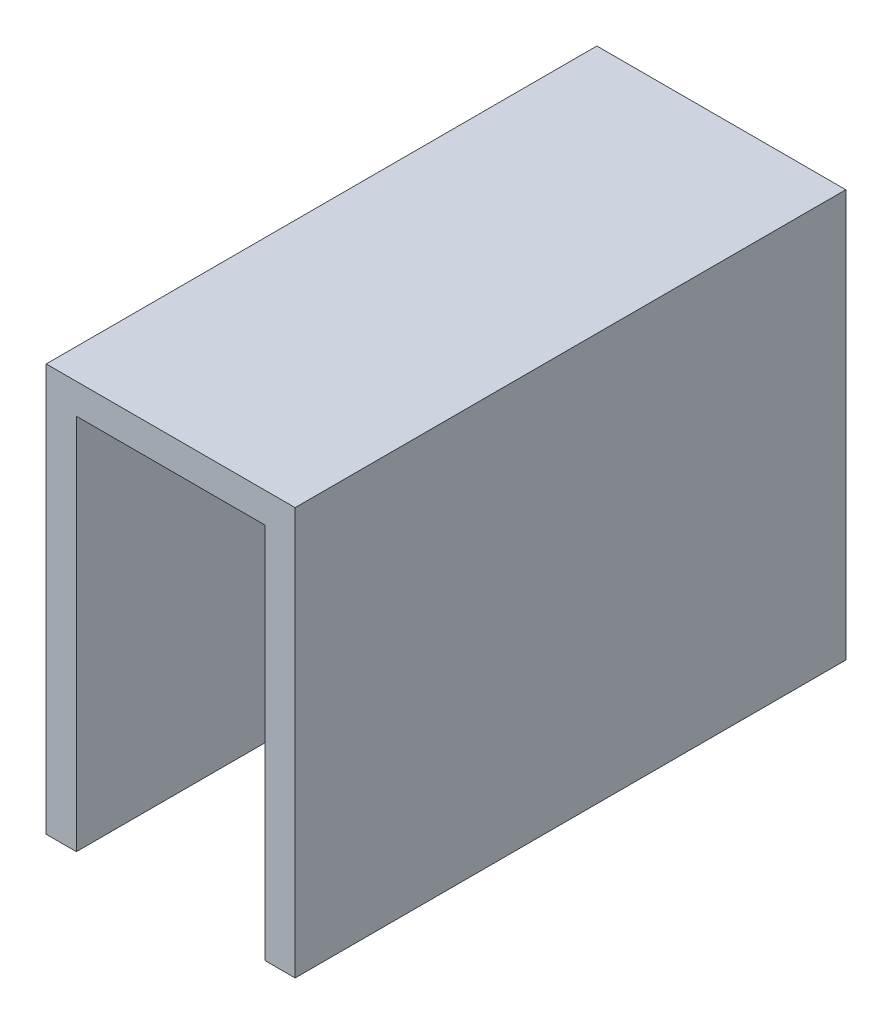
ISO-10303-21;
HEADER;
FILE_DESCRIPTION(('STEP AP214'),'2;1');
FILE_NAME('part.step','',(''),(''),'','','');
FILE_SCHEMA(('AUTOMOTIVE_DESIGN { 1 0 10303 214 1 1 1 1 }'));
ENDSEC;
DATA;
#1=APPLICATION_CONTEXT('core data for automotive mechanical design processes');
#2=APPLICATION_PROTOCOL_DEFINITION('international standard','automotive_design',2000,#1);
#3=PRODUCT_CONTEXT('',#1,'mechanical');
#4=PRODUCT('Part','Part','',(#3));
#5=PRODUCT_RELATED_PRODUCT_CATEGORY('part','',(#4));
#6=PRODUCT_DEFINITION_FORMATION('','',#4);
#7=PRODUCT_DEFINITION_CONTEXT('part definition',#1,'design');
#8=PRODUCT_DEFINITION('design','',#6,#7);
#9=PRODUCT_DEFINITION_SHAPE('','',#8);
#10=(LENGTH_UNIT() NAMED_UNIT(*) SI_UNIT(.MILLI.,.METRE.));
#11=(NAMED_UNIT(*) PLANE_ANGLE_UNIT() SI_UNIT($,.RADIAN.));
#12=(NAMED_UNIT(*) SI_UNIT($,.STERADIAN.) SOLID_ANGLE_UNIT());
#13=UNCERTAINTY_MEASURE_WITH_UNIT(LENGTH_MEASURE(1.E-05),#10,'distance_accuracy_value','');
#14=(GEOMETRIC_REPRESENTATION_CONTEXT(3) GLOBAL_UNCERTAINTY_ASSIGNED_CONTEXT((#13)) GLOBAL_UNIT_ASSIGNED_CONTEXT((#10,
#11,#12)) REPRESENTATION_CONTEXT('',''));
#15=CARTESIAN_POINT('',(0.,0.,0.));
#16=DIRECTION('',(0.,0.,1.));
#17=DIRECTION('',(1.,0.,0.));
#18=AXIS2_PLACEMENT_3D('',#15,#16,#17);
#19=CARTESIAN_POINT('',(0.,0.,70.));
#20=DIRECTION('',(0.,0.,-1.));
#21=DIRECTION('',(-1.,0.,0.));
#22=AXIS2_PLACEMENT_3D('',#19,#20,#21);
#23=PLANE('',#22);
#24=DIRECTION('',(0.,-1.,0.));
#25=VECTOR('',#24,1.);
#26=CARTESIAN_POINT('',(-16.5,29.,70.));
#27=LINE('',#26,#25);
#28=CARTESIAN_POINT('',(-16.5,29.,70.));
#29=VERTEX_POINT('',#28);
#30=CARTESIAN_POINT('',(-16.5,-25.,70.));
#31=VERTEX_POINT('',#30);
#32=EDGE_CURVE('E153',#29,#31,#27,.T.);
#33=ORIENTED_EDGE('',*,*,#32,.T.);
#34=DIRECTION('',(-1.,0.,0.));
#35=VECTOR('',#34,1.);
#36=CARTESIAN_POINT('',(-16.5,-25.,70.));
#37=LINE('',#36,#35);
#38=CARTESIAN_POINT('',(-12.5,-25.,70.));
#39=VERTEX_POINT('',#38);
#40=EDGE_CURVE('E164',#39,#31,#37,.T.);
#41=ORIENTED_EDGE('',*,*,#40,.F.);
#42=DIRECTION('',(0.,-1.,0.));
#43=VECTOR('',#42,1.);
#44=CARTESIAN_POINT('',(-12.5,25.,70.));
#45=LINE('',#44,#43);
#46=CARTESIAN_POINT('',(-12.5,25.,70.));
#47=VERTEX_POINT('',#46);
#48=EDGE_CURVE('E126',#47,#39,#45,.T.);
#49=ORIENTED_EDGE('',*,*,#48,.F.);
#50=DIRECTION('',(-1.,0.,0.));
#51=VECTOR('',#50,1.);
#52=CARTESIAN_POINT('',(-12.5,25.,70.));
#53=LINE('',#52,#51);
#54=CARTESIAN_POINT('',(12.5,25.,70.));
#55=VERTEX_POINT('',#54);
#56=EDGE_CURVE('E132',#55,#47,#53,.T.);
#57=ORIENTED_EDGE('',*,*,#56,.F.);
#58=DIRECTION('',(0.,1.,0.));
#59=VECTOR('',#58,1.);
#60=CARTESIAN_POINT('',(12.5,25.,70.));
#61=LINE('',#60,#59);
#62=CARTESIAN_POINT('',(12.5,-25.,70.));
#63=VERTEX_POINT('',#62);
#64=EDGE_CURVE('E129',#63,#55,#61,.T.);
#65=ORIENTED_EDGE('',*,*,#64,.F.);
#66=CARTESIAN_POINT('',(16.5,-25.,70.));
#67=VERTEX_POINT('',#66);
#68=EDGE_CURVE('E103',#67,#63,#37,.T.);
#69=ORIENTED_EDGE('',*,*,#68,.F.);
#70=DIRECTION('',(0.,1.,0.));
#71=VECTOR('',#70,1.);
#72=CARTESIAN_POINT('',(16.5,29.,70.));
#73=LINE('',#72,#71);
#74=CARTESIAN_POINT('',(16.5,29.,70.));
#75=VERTEX_POINT('',#74);
#76=EDGE_CURVE('E111',#67,#75,#73,.T.);
#77=ORIENTED_EDGE('',*,*,#76,.T.);
#78=DIRECTION('',(-1.,0.,0.));
#79=VECTOR('',#78,1.);
#80=CARTESIAN_POINT('',(-16.5,29.,70.));
#81=LINE('',#80,#79);
#82=EDGE_CURVE('E150',#75,#29,#81,.T.);
#83=ORIENTED_EDGE('',*,*,#82,.T.);
#84=EDGE_LOOP('',(#33,#41,#49,#57,#65,#69,#77,#83));
#85=FACE_BOUND('',#84,.T.);
#86=ADVANCED_FACE('F33',(#85),#23,.F.);
#87=CARTESIAN_POINT('',(-16.5,29.,70.));
#88=DIRECTION('',(0.,-1.,0.));
#89=DIRECTION('',(0.,0.,-1.));
#90=AXIS2_PLACEMENT_3D('',#87,#88,#89);
#91=PLANE('',#90);
#92=DIRECTION('',(0.,0.,-1.));
#93=VECTOR('',#92,1.);
#94=CARTESIAN_POINT('',(16.5,29.,70.));
#95=LINE('',#94,#93);
#96=CARTESIAN_POINT('',(16.5,29.,-3.));
#97=VERTEX_POINT('',#96);
#98=EDGE_CURVE('E41',#75,#97,#95,.T.);
#99=ORIENTED_EDGE('',*,*,#98,.T.);
#100=DIRECTION('',(1.,0.,0.));
#101=VECTOR('',#100,1.);
#102=CARTESIAN_POINT('',(-16.5,29.,-3.));
#103=LINE('',#102,#101);
#104=CARTESIAN_POINT('',(-16.5,29.,-3.));
#105=VERTEX_POINT('',#104);
#106=EDGE_CURVE('E116',#105,#97,#103,.T.);
#107=ORIENTED_EDGE('',*,*,#106,.F.);
#108=DIRECTION('',(0.,0.,-1.));
#109=VECTOR('',#108,1.);
#110=CARTESIAN_POINT('',(-16.5,29.,70.));
#111=LINE('',#110,#109);
#112=EDGE_CURVE('E11',#29,#105,#111,.T.);
#113=ORIENTED_EDGE('',*,*,#112,.F.);
#114=ORIENTED_EDGE('',*,*,#82,.F.);
#115=EDGE_LOOP('',(#99,#107,#113,#114));
#116=FACE_BOUND('',#115,.T.);
#117=ADVANCED_FACE('F35',(#116),#91,.F.);
#118=CARTESIAN_POINT('',(-16.5,29.,70.));
#119=DIRECTION('',(1.,0.,0.));
#120=DIRECTION('',(0.,0.,-1.));
#121=AXIS2_PLACEMENT_3D('',#118,#119,#120);
#122=PLANE('',#121);
#123=DIRECTION('',(0.,1.,0.));
#124=VECTOR('',#123,1.);
#125=CARTESIAN_POINT('',(-16.5,-29.,-3.));
#126=LINE('',#125,#124);
#127=CARTESIAN_POINT('',(-16.5,-25.,-3.));
#128=VERTEX_POINT('',#127);
#129=EDGE_CURVE('E122',#128,#105,#126,.T.);
#130=ORIENTED_EDGE('',*,*,#129,.F.);
#131=DIRECTION('',(0.,0.,1.));
#132=VECTOR('',#131,1.);
#133=CARTESIAN_POINT('',(-16.5,-25.,-3.));
#134=LINE('',#133,#132);
#135=EDGE_CURVE('E48',#128,#31,#134,.T.);
#136=ORIENTED_EDGE('',*,*,#135,.T.);
#137=ORIENTED_EDGE('',*,*,#32,.F.);
#138=ORIENTED_EDGE('',*,*,#112,.T.);
#139=EDGE_LOOP('',(#130,#136,#137,#138));
#140=FACE_BOUND('',#139,.T.);
#141=ADVANCED_FACE('F168',(#140),#122,.F.);
#142=CARTESIAN_POINT('',(16.5,29.,70.));
#143=DIRECTION('',(-1.,0.,0.));
#144=DIRECTION('',(0.,0.,1.));
#145=AXIS2_PLACEMENT_3D('',#142,#143,#144);
#146=PLANE('',#145);
#147=ORIENTED_EDGE('',*,*,#76,.F.);
#148=DIRECTION('',(0.,0.,1.));
#149=VECTOR('',#148,1.);
#150=CARTESIAN_POINT('',(16.5,-25.,-3.));
#151=LINE('',#150,#149);
#152=CARTESIAN_POINT('',(16.5,-25.,-3.));
#153=VERTEX_POINT('',#152);
#154=EDGE_CURVE('E98',#153,#67,#151,.T.);
#155=ORIENTED_EDGE('',*,*,#154,.F.);
#156=DIRECTION('',(0.,-1.,0.));
#157=VECTOR('',#156,1.);
#158=CARTESIAN_POINT('',(16.5,29.,-3.));
#159=LINE('',#158,#157);
#160=EDGE_CURVE('E110',#97,#153,#159,.T.);
#161=ORIENTED_EDGE('',*,*,#160,.F.);
#162=ORIENTED_EDGE('',*,*,#98,.F.);
#163=EDGE_LOOP('',(#147,#155,#161,#162));
#164=FACE_BOUND('',#163,.T.);
#165=ADVANCED_FACE('F108',(#164),#146,.F.);
#166=CARTESIAN_POINT('',(-12.5,25.,70.));
#167=DIRECTION('',(1.,0.,0.));
#168=DIRECTION('',(0.,0.,-1.));
#169=AXIS2_PLACEMENT_3D('',#166,#167,#168);
#170=PLANE('',#169);
#171=DIRECTION('',(0.,-1.,0.));
#172=VECTOR('',#171,1.);
#173=CARTESIAN_POINT('',(-12.5,25.,0.));
#174=LINE('',#173,#172);
#175=CARTESIAN_POINT('',(-12.5,25.,0.));
#176=VERTEX_POINT('',#175);
#177=CARTESIAN_POINT('',(-12.5,-25.,0.));
#178=VERTEX_POINT('',#177);
#179=EDGE_CURVE('E117',#176,#178,#174,.T.);
#180=ORIENTED_EDGE('',*,*,#179,.F.);
#181=DIRECTION('',(0.,0.,-1.));
#182=VECTOR('',#181,1.);
#183=CARTESIAN_POINT('',(-12.5,25.,70.));
#184=LINE('',#183,#182);
#185=EDGE_CURVE('E133',#47,#176,#184,.T.);
#186=ORIENTED_EDGE('',*,*,#185,.F.);
#187=ORIENTED_EDGE('',*,*,#48,.T.);
#188=DIRECTION('',(0.,0.,-1.));
#189=VECTOR('',#188,1.);
#190=CARTESIAN_POINT('',(-12.5,-25.,70.));
#191=LINE('',#190,#189);
#192=EDGE_CURVE('E147',#39,#178,#191,.T.);
#193=ORIENTED_EDGE('',*,*,#192,.T.);
#194=EDGE_LOOP('',(#180,#186,#187,#193));
#195=FACE_BOUND('',#194,.T.);
#196=ADVANCED_FACE('F174',(#195),#170,.T.);
#197=CARTESIAN_POINT('',(12.5,25.,70.));
#198=DIRECTION('',(-1.,0.,0.));
#199=DIRECTION('',(0.,0.,1.));
#200=AXIS2_PLACEMENT_3D('',#197,#198,#199);
#201=PLANE('',#200);
#202=DIRECTION('',(0.,1.,0.));
#203=VECTOR('',#202,1.);
#204=CARTESIAN_POINT('',(12.5,25.,0.));
#205=LINE('',#204,#203);
#206=CARTESIAN_POINT('',(12.5,-25.,0.));
#207=VERTEX_POINT('',#206);
#208=CARTESIAN_POINT('',(12.5,25.,0.));
#209=VERTEX_POINT('',#208);
#210=EDGE_CURVE('E137',#207,#209,#205,.T.);
#211=ORIENTED_EDGE('',*,*,#210,.F.);
#212=DIRECTION('',(0.,0.,-1.));
#213=VECTOR('',#212,1.);
#214=CARTESIAN_POINT('',(12.5,-25.,70.));
#215=LINE('',#214,#213);
#216=EDGE_CURVE('E145',#63,#207,#215,.T.);
#217=ORIENTED_EDGE('',*,*,#216,.F.);
#218=ORIENTED_EDGE('',*,*,#64,.T.);
#219=DIRECTION('',(0.,0.,-1.));
#220=VECTOR('',#219,1.);
#221=CARTESIAN_POINT('',(12.5,25.,70.));
#222=LINE('',#221,#220);
#223=EDGE_CURVE('E56',#55,#209,#222,.T.);
#224=ORIENTED_EDGE('',*,*,#223,.T.);
#225=EDGE_LOOP('',(#211,#217,#218,#224));
#226=FACE_BOUND('',#225,.T.);
#227=ADVANCED_FACE('F184',(#226),#201,.T.);
#228=CARTESIAN_POINT('',(-12.5,25.,70.));
#229=DIRECTION('',(0.,-1.,0.));
#230=DIRECTION('',(0.,0.,-1.));
#231=AXIS2_PLACEMENT_3D('',#228,#229,#230);
#232=PLANE('',#231);
#233=DIRECTION('',(-1.,0.,0.));
#234=VECTOR('',#233,1.);
#235=CARTESIAN_POINT('',(-12.5,25.,0.));
#236=LINE('',#235,#234);
#237=EDGE_CURVE('E130',#209,#176,#236,.T.);
#238=ORIENTED_EDGE('',*,*,#237,.F.);
#239=ORIENTED_EDGE('',*,*,#223,.F.);
#240=ORIENTED_EDGE('',*,*,#56,.T.);
#241=ORIENTED_EDGE('',*,*,#185,.T.);
#242=EDGE_LOOP('',(#238,#239,#240,#241));
#243=FACE_BOUND('',#242,.T.);
#244=ADVANCED_FACE('F188',(#243),#232,.T.);
#245=CARTESIAN_POINT('',(0.,0.,0.));
#246=DIRECTION('',(0.,0.,-1.));
#247=DIRECTION('',(-1.,0.,0.));
#248=AXIS2_PLACEMENT_3D('',#245,#246,#247);
#249=PLANE('',#248);
#250=ORIENTED_EDGE('',*,*,#210,.T.);
#251=ORIENTED_EDGE('',*,*,#237,.T.);
#252=ORIENTED_EDGE('',*,*,#179,.T.);
#253=DIRECTION('',(1.,0.,0.));
#254=VECTOR('',#253,1.);
#255=CARTESIAN_POINT('',(-12.5,-25.,0.));
#256=LINE('',#255,#254);
#257=EDGE_CURVE('E120',#178,#207,#256,.T.);
#258=ORIENTED_EDGE('',*,*,#257,.T.);
#259=EDGE_LOOP('',(#250,#251,#252,#258));
#260=FACE_BOUND('',#259,.T.);
#261=ADVANCED_FACE('F191',(#260),#249,.F.);
#262=CARTESIAN_POINT('',(0.,0.,-3.));
#263=DIRECTION('',(0.,0.,-1.));
#264=DIRECTION('',(-1.,0.,0.));
#265=AXIS2_PLACEMENT_3D('',#262,#263,#264);
#266=PLANE('',#265);
#267=DIRECTION('',(-1.,0.,0.));
#268=VECTOR('',#267,1.);
#269=CARTESIAN_POINT('',(-16.5,-25.,-3.));
#270=LINE('',#269,#268);
#271=EDGE_CURVE('E95',#153,#128,#270,.T.);
#272=ORIENTED_EDGE('',*,*,#271,.T.);
#273=ORIENTED_EDGE('',*,*,#129,.T.);
#274=ORIENTED_EDGE('',*,*,#106,.T.);
#275=ORIENTED_EDGE('',*,*,#160,.T.);
#276=EDGE_LOOP('',(#272,#273,#274,#275));
#277=FACE_BOUND('',#276,.T.);
#278=ADVANCED_FACE('F114',(#277),#266,.T.);
#279=CARTESIAN_POINT('',(-16.5,-25.,-3.));
#280=DIRECTION('',(0.,1.,0.));
#281=DIRECTION('',(-1.,0.,0.));
#282=AXIS2_PLACEMENT_3D('',#279,#280,#281);
#283=PLANE('',#282);
#284=ORIENTED_EDGE('',*,*,#192,.F.);
#285=ORIENTED_EDGE('',*,*,#40,.T.);
#286=ORIENTED_EDGE('',*,*,#135,.F.);
#287=ORIENTED_EDGE('',*,*,#271,.F.);
#288=ORIENTED_EDGE('',*,*,#154,.T.);
#289=ORIENTED_EDGE('',*,*,#68,.T.);
#290=ORIENTED_EDGE('',*,*,#216,.T.);
#291=ORIENTED_EDGE('',*,*,#257,.F.);
#292=EDGE_LOOP('',(#284,#285,#286,#287,#288,#289,#290,#291));
#293=FACE_BOUND('',#292,.T.);
#294=ADVANCED_FACE('F97',(#293),#283,.F.);
#295=CLOSED_SHELL('',(#86,#117,#141,#165,#196,#227,#244,#261,#278,#294));
#296=MANIFOLD_SOLID_BREP('B2',#295);
#297=ADVANCED_BREP_SHAPE_REPRESENTATION('',(#18,#296),#14);
#298=SHAPE_DEFINITION_REPRESENTATION(#9,#297);
ENDSEC;
END-ISO-10303-21;
